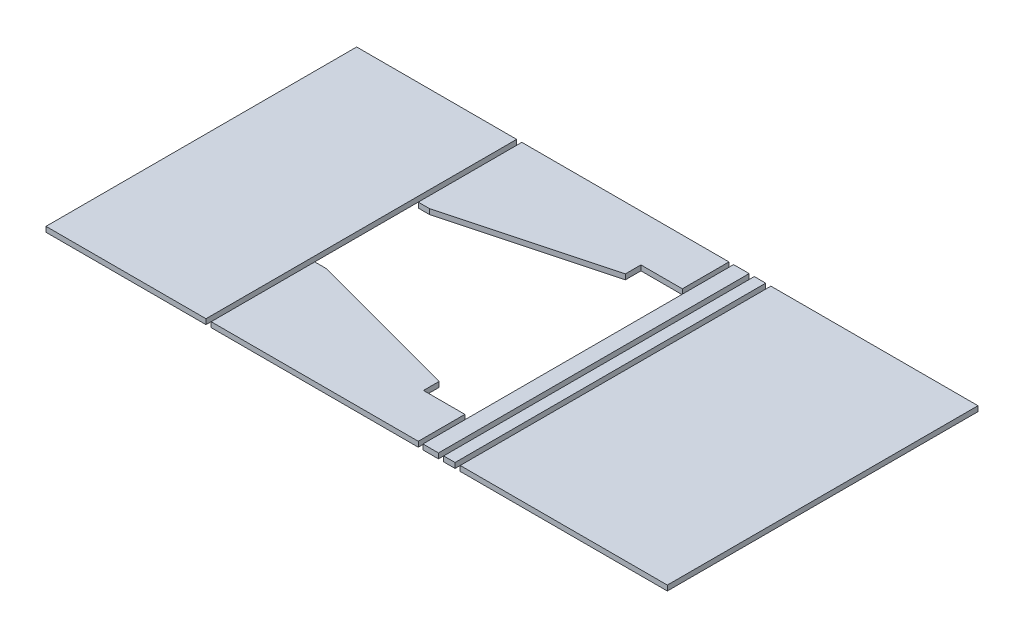
ISO-10303-21;
HEADER;
FILE_DESCRIPTION(('STEP AP214'),'2;1');
FILE_NAME('part.step','',(''),(''),'','','');
FILE_SCHEMA(('AUTOMOTIVE_DESIGN { 1 0 10303 214 1 1 1 1 }'));
ENDSEC;
DATA;
#1=APPLICATION_CONTEXT('core data for automotive mechanical design processes');
#2=APPLICATION_PROTOCOL_DEFINITION('international standard','automotive_design',2000,#1);
#3=PRODUCT_CONTEXT('',#1,'mechanical');
#4=PRODUCT('Part','Part','',(#3));
#5=PRODUCT_RELATED_PRODUCT_CATEGORY('part','',(#4));
#6=PRODUCT_DEFINITION_FORMATION('','',#4);
#7=PRODUCT_DEFINITION_CONTEXT('part definition',#1,'design');
#8=PRODUCT_DEFINITION('design','',#6,#7);
#9=PRODUCT_DEFINITION_SHAPE('','',#8);
#10=(LENGTH_UNIT() NAMED_UNIT(*) SI_UNIT(.MILLI.,.METRE.));
#11=(NAMED_UNIT(*) PLANE_ANGLE_UNIT() SI_UNIT($,.RADIAN.));
#12=(NAMED_UNIT(*) SI_UNIT($,.STERADIAN.) SOLID_ANGLE_UNIT());
#13=UNCERTAINTY_MEASURE_WITH_UNIT(LENGTH_MEASURE(1.E-05),#10,'distance_accuracy_value','');
#14=(GEOMETRIC_REPRESENTATION_CONTEXT(3) GLOBAL_UNCERTAINTY_ASSIGNED_CONTEXT((#13)) GLOBAL_UNIT_ASSIGNED_CONTEXT((#10,
#11,#12)) REPRESENTATION_CONTEXT('',''));
#15=CARTESIAN_POINT('',(0.,0.,0.));
#16=DIRECTION('',(0.,0.,1.));
#17=DIRECTION('',(1.,0.,0.));
#18=AXIS2_PLACEMENT_3D('',#15,#16,#17);
#19=CARTESIAN_POINT('',(758.,10.,-600.));
#20=DIRECTION('',(0.,0.,1.));
#21=DIRECTION('',(1.,0.,0.));
#22=AXIS2_PLACEMENT_3D('',#19,#20,#21);
#23=PLANE('',#22);
#24=DIRECTION('',(-1.,0.,0.));
#25=VECTOR('',#24,1.);
#26=CARTESIAN_POINT('',(758.,0.,-600.));
#27=LINE('',#26,#25);
#28=CARTESIAN_POINT('',(758.,0.,-600.));
#29=VERTEX_POINT('',#28);
#30=CARTESIAN_POINT('',(728.,0.,-600.));
#31=VERTEX_POINT('',#30);
#32=EDGE_CURVE('E12',#29,#31,#27,.T.);
#33=ORIENTED_EDGE('',*,*,#32,.T.);
#34=DIRECTION('',(0.,-1.,0.));
#35=VECTOR('',#34,1.);
#36=CARTESIAN_POINT('',(728.,10.,-600.));
#37=LINE('',#36,#35);
#38=CARTESIAN_POINT('',(728.,10.,-600.));
#39=VERTEX_POINT('',#38);
#40=EDGE_CURVE('E121',#39,#31,#37,.T.);
#41=ORIENTED_EDGE('',*,*,#40,.F.);
#42=DIRECTION('',(-1.,0.,0.));
#43=VECTOR('',#42,1.);
#44=CARTESIAN_POINT('',(758.,10.,-600.));
#45=LINE('',#44,#43);
#46=CARTESIAN_POINT('',(758.,10.,-600.));
#47=VERTEX_POINT('',#46);
#48=EDGE_CURVE('E54',#47,#39,#45,.T.);
#49=ORIENTED_EDGE('',*,*,#48,.F.);
#50=DIRECTION('',(0.,-1.,0.));
#51=VECTOR('',#50,1.);
#52=CARTESIAN_POINT('',(758.,10.,-600.));
#53=LINE('',#52,#51);
#54=EDGE_CURVE('E94',#47,#29,#53,.T.);
#55=ORIENTED_EDGE('',*,*,#54,.T.);
#56=EDGE_LOOP('',(#33,#41,#49,#55));
#57=FACE_BOUND('',#56,.T.);
#58=ADVANCED_FACE('F50',(#57),#23,.F.);
#59=CARTESIAN_POINT('',(728.,10.,-600.));
#60=DIRECTION('',(1.,0.,0.));
#61=DIRECTION('',(0.,0.,-1.));
#62=AXIS2_PLACEMENT_3D('',#59,#60,#61);
#63=PLANE('',#62);
#64=DIRECTION('',(0.,0.,1.));
#65=VECTOR('',#64,1.);
#66=CARTESIAN_POINT('',(728.,0.,-600.));
#67=LINE('',#66,#65);
#68=CARTESIAN_POINT('',(728.,0.,0.));
#69=VERTEX_POINT('',#68);
#70=EDGE_CURVE('E60',#31,#69,#67,.T.);
#71=ORIENTED_EDGE('',*,*,#70,.T.);
#72=DIRECTION('',(0.,-1.,0.));
#73=VECTOR('',#72,1.);
#74=CARTESIAN_POINT('',(728.,10.,0.));
#75=LINE('',#74,#73);
#76=CARTESIAN_POINT('',(728.,10.,0.));
#77=VERTEX_POINT('',#76);
#78=EDGE_CURVE('E108',#77,#69,#75,.T.);
#79=ORIENTED_EDGE('',*,*,#78,.F.);
#80=DIRECTION('',(0.,0.,1.));
#81=VECTOR('',#80,1.);
#82=CARTESIAN_POINT('',(728.,10.,-600.));
#83=LINE('',#82,#81);
#84=EDGE_CURVE('E86',#39,#77,#83,.T.);
#85=ORIENTED_EDGE('',*,*,#84,.F.);
#86=ORIENTED_EDGE('',*,*,#40,.T.);
#87=EDGE_LOOP('',(#71,#79,#85,#86));
#88=FACE_BOUND('',#87,.T.);
#89=ADVANCED_FACE('F124',(#88),#63,.F.);
#90=CARTESIAN_POINT('',(758.,10.,0.));
#91=DIRECTION('',(0.,0.,1.));
#92=DIRECTION('',(1.,0.,0.));
#93=AXIS2_PLACEMENT_3D('',#90,#91,#92);
#94=PLANE('',#93);
#95=DIRECTION('',(-1.,0.,0.));
#96=VECTOR('',#95,1.);
#97=CARTESIAN_POINT('',(758.,0.,0.));
#98=LINE('',#97,#96);
#99=CARTESIAN_POINT('',(758.,0.,0.));
#100=VERTEX_POINT('',#99);
#101=EDGE_CURVE('E110',#100,#69,#98,.T.);
#102=ORIENTED_EDGE('',*,*,#101,.F.);
#103=DIRECTION('',(0.,-1.,0.));
#104=VECTOR('',#103,1.);
#105=CARTESIAN_POINT('',(758.,10.,0.));
#106=LINE('',#105,#104);
#107=CARTESIAN_POINT('',(758.,10.,0.));
#108=VERTEX_POINT('',#107);
#109=EDGE_CURVE('E99',#108,#100,#106,.T.);
#110=ORIENTED_EDGE('',*,*,#109,.F.);
#111=DIRECTION('',(-1.,0.,0.));
#112=VECTOR('',#111,1.);
#113=CARTESIAN_POINT('',(758.,10.,0.));
#114=LINE('',#113,#112);
#115=EDGE_CURVE('E119',#108,#77,#114,.T.);
#116=ORIENTED_EDGE('',*,*,#115,.T.);
#117=ORIENTED_EDGE('',*,*,#78,.T.);
#118=EDGE_LOOP('',(#102,#110,#116,#117));
#119=FACE_BOUND('',#118,.T.);
#120=ADVANCED_FACE('F111',(#119),#94,.T.);
#121=CARTESIAN_POINT('',(758.,10.,-600.));
#122=DIRECTION('',(1.,0.,0.));
#123=DIRECTION('',(0.,0.,-1.));
#124=AXIS2_PLACEMENT_3D('',#121,#122,#123);
#125=PLANE('',#124);
#126=DIRECTION('',(0.,0.,1.));
#127=VECTOR('',#126,1.);
#128=CARTESIAN_POINT('',(758.,0.,-600.));
#129=LINE('',#128,#127);
#130=EDGE_CURVE('E103',#29,#100,#129,.T.);
#131=ORIENTED_EDGE('',*,*,#130,.F.);
#132=ORIENTED_EDGE('',*,*,#54,.F.);
#133=DIRECTION('',(0.,0.,1.));
#134=VECTOR('',#133,1.);
#135=CARTESIAN_POINT('',(758.,10.,-600.));
#136=LINE('',#135,#134);
#137=EDGE_CURVE('E105',#47,#108,#136,.T.);
#138=ORIENTED_EDGE('',*,*,#137,.T.);
#139=ORIENTED_EDGE('',*,*,#109,.T.);
#140=EDGE_LOOP('',(#131,#132,#138,#139));
#141=FACE_BOUND('',#140,.T.);
#142=ADVANCED_FACE('F101',(#141),#125,.T.);
#143=CARTESIAN_POINT('',(0.,10.,0.));
#144=DIRECTION('',(0.,1.,0.));
#145=DIRECTION('',(0.,0.,1.));
#146=AXIS2_PLACEMENT_3D('',#143,#144,#145);
#147=PLANE('',#146);
#148=ORIENTED_EDGE('',*,*,#48,.T.);
#149=ORIENTED_EDGE('',*,*,#84,.T.);
#150=ORIENTED_EDGE('',*,*,#115,.F.);
#151=ORIENTED_EDGE('',*,*,#137,.F.);
#152=EDGE_LOOP('',(#148,#149,#150,#151));
#153=FACE_BOUND('',#152,.T.);
#154=ADVANCED_FACE('F52',(#153),#147,.T.);
#155=CARTESIAN_POINT('',(0.,0.,0.));
#156=DIRECTION('',(0.,1.,0.));
#157=DIRECTION('',(0.,0.,1.));
#158=AXIS2_PLACEMENT_3D('',#155,#156,#157);
#159=PLANE('',#158);
#160=ORIENTED_EDGE('',*,*,#32,.F.);
#161=ORIENTED_EDGE('',*,*,#130,.T.);
#162=ORIENTED_EDGE('',*,*,#101,.T.);
#163=ORIENTED_EDGE('',*,*,#70,.F.);
#164=EDGE_LOOP('',(#160,#161,#162,#163));
#165=FACE_BOUND('',#164,.T.);
#166=ADVANCED_FACE('F113',(#165),#159,.F.);
#167=CLOSED_SHELL('',(#58,#89,#120,#142,#154,#166));
#168=MANIFOLD_SOLID_BREP('B2',#167);
#169=CARTESIAN_POINT('',(790.,10.,0.));
#170=DIRECTION('',(0.,0.,1.));
#171=DIRECTION('',(1.,0.,0.));
#172=AXIS2_PLACEMENT_3D('',#169,#170,#171);
#173=PLANE('',#172);
#174=DIRECTION('',(-1.,0.,0.));
#175=VECTOR('',#174,1.);
#176=CARTESIAN_POINT('',(790.,0.,0.));
#177=LINE('',#176,#175);
#178=CARTESIAN_POINT('',(790.,0.,0.));
#179=VERTEX_POINT('',#178);
#180=CARTESIAN_POINT('',(768.,0.,0.));
#181=VERTEX_POINT('',#180);
#182=EDGE_CURVE('E48',#179,#181,#177,.T.);
#183=ORIENTED_EDGE('',*,*,#182,.F.);
#184=DIRECTION('',(0.,-1.,0.));
#185=VECTOR('',#184,1.);
#186=CARTESIAN_POINT('',(790.,10.,0.));
#187=LINE('',#186,#185);
#188=CARTESIAN_POINT('',(790.,10.,0.));
#189=VERTEX_POINT('',#188);
#190=EDGE_CURVE('E230',#189,#179,#187,.T.);
#191=ORIENTED_EDGE('',*,*,#190,.F.);
#192=DIRECTION('',(-1.,0.,0.));
#193=VECTOR('',#192,1.);
#194=CARTESIAN_POINT('',(790.,10.,0.));
#195=LINE('',#194,#193);
#196=CARTESIAN_POINT('',(768.,10.,0.));
#197=VERTEX_POINT('',#196);
#198=EDGE_CURVE('E188',#189,#197,#195,.T.);
#199=ORIENTED_EDGE('',*,*,#198,.T.);
#200=DIRECTION('',(0.,-1.,0.));
#201=VECTOR('',#200,1.);
#202=CARTESIAN_POINT('',(768.,10.,0.));
#203=LINE('',#202,#201);
#204=EDGE_CURVE('E203',#197,#181,#203,.T.);
#205=ORIENTED_EDGE('',*,*,#204,.T.);
#206=EDGE_LOOP('',(#183,#191,#199,#205));
#207=FACE_BOUND('',#206,.T.);
#208=ADVANCED_FACE('F184',(#207),#173,.T.);
#209=CARTESIAN_POINT('',(790.,10.,0.));
#210=DIRECTION('',(-1.,0.,0.));
#211=DIRECTION('',(0.,0.,1.));
#212=AXIS2_PLACEMENT_3D('',#209,#210,#211);
#213=PLANE('',#212);
#214=DIRECTION('',(0.,0.,-1.));
#215=VECTOR('',#214,1.);
#216=CARTESIAN_POINT('',(790.,0.,0.));
#217=LINE('',#216,#215);
#218=CARTESIAN_POINT('',(790.,0.,-600.));
#219=VERTEX_POINT('',#218);
#220=EDGE_CURVE('E233',#179,#219,#217,.T.);
#221=ORIENTED_EDGE('',*,*,#220,.T.);
#222=DIRECTION('',(0.,-1.,0.));
#223=VECTOR('',#222,1.);
#224=CARTESIAN_POINT('',(790.,10.,-600.));
#225=LINE('',#224,#223);
#226=CARTESIAN_POINT('',(790.,10.,-600.));
#227=VERTEX_POINT('',#226);
#228=EDGE_CURVE('E236',#227,#219,#225,.T.);
#229=ORIENTED_EDGE('',*,*,#228,.F.);
#230=DIRECTION('',(0.,0.,-1.));
#231=VECTOR('',#230,1.);
#232=CARTESIAN_POINT('',(790.,10.,0.));
#233=LINE('',#232,#231);
#234=EDGE_CURVE('E252',#189,#227,#233,.T.);
#235=ORIENTED_EDGE('',*,*,#234,.F.);
#236=ORIENTED_EDGE('',*,*,#190,.T.);
#237=EDGE_LOOP('',(#221,#229,#235,#236));
#238=FACE_BOUND('',#237,.T.);
#239=ADVANCED_FACE('F235',(#238),#213,.F.);
#240=CARTESIAN_POINT('',(790.,10.,-600.));
#241=DIRECTION('',(0.,0.,1.));
#242=DIRECTION('',(1.,0.,0.));
#243=AXIS2_PLACEMENT_3D('',#240,#241,#242);
#244=PLANE('',#243);
#245=DIRECTION('',(-1.,0.,0.));
#246=VECTOR('',#245,1.);
#247=CARTESIAN_POINT('',(790.,0.,-600.));
#248=LINE('',#247,#246);
#249=CARTESIAN_POINT('',(768.,0.,-600.));
#250=VERTEX_POINT('',#249);
#251=EDGE_CURVE('E239',#219,#250,#248,.T.);
#252=ORIENTED_EDGE('',*,*,#251,.T.);
#253=DIRECTION('',(0.,-1.,0.));
#254=VECTOR('',#253,1.);
#255=CARTESIAN_POINT('',(768.,10.,-600.));
#256=LINE('',#255,#254);
#257=CARTESIAN_POINT('',(768.,10.,-600.));
#258=VERTEX_POINT('',#257);
#259=EDGE_CURVE('E245',#258,#250,#256,.T.);
#260=ORIENTED_EDGE('',*,*,#259,.F.);
#261=DIRECTION('',(-1.,0.,0.));
#262=VECTOR('',#261,1.);
#263=CARTESIAN_POINT('',(790.,10.,-600.));
#264=LINE('',#263,#262);
#265=EDGE_CURVE('E220',#227,#258,#264,.T.);
#266=ORIENTED_EDGE('',*,*,#265,.F.);
#267=ORIENTED_EDGE('',*,*,#228,.T.);
#268=EDGE_LOOP('',(#252,#260,#266,#267));
#269=FACE_BOUND('',#268,.T.);
#270=ADVANCED_FACE('F243',(#269),#244,.F.);
#271=CARTESIAN_POINT('',(768.,10.,0.));
#272=DIRECTION('',(-1.,0.,0.));
#273=DIRECTION('',(0.,0.,1.));
#274=AXIS2_PLACEMENT_3D('',#271,#272,#273);
#275=PLANE('',#274);
#276=DIRECTION('',(0.,0.,-1.));
#277=VECTOR('',#276,1.);
#278=CARTESIAN_POINT('',(768.,0.,0.));
#279=LINE('',#278,#277);
#280=EDGE_CURVE('E194',#181,#250,#279,.T.);
#281=ORIENTED_EDGE('',*,*,#280,.F.);
#282=ORIENTED_EDGE('',*,*,#204,.F.);
#283=DIRECTION('',(0.,0.,-1.));
#284=VECTOR('',#283,1.);
#285=CARTESIAN_POINT('',(768.,10.,0.));
#286=LINE('',#285,#284);
#287=EDGE_CURVE('E254',#197,#258,#286,.T.);
#288=ORIENTED_EDGE('',*,*,#287,.T.);
#289=ORIENTED_EDGE('',*,*,#259,.T.);
#290=EDGE_LOOP('',(#281,#282,#288,#289));
#291=FACE_BOUND('',#290,.T.);
#292=ADVANCED_FACE('F257',(#291),#275,.T.);
#293=CARTESIAN_POINT('',(0.,10.,0.));
#294=DIRECTION('',(0.,-1.,0.));
#295=DIRECTION('',(0.,0.,-1.));
#296=AXIS2_PLACEMENT_3D('',#293,#294,#295);
#297=PLANE('',#296);
#298=ORIENTED_EDGE('',*,*,#198,.F.);
#299=ORIENTED_EDGE('',*,*,#234,.T.);
#300=ORIENTED_EDGE('',*,*,#265,.T.);
#301=ORIENTED_EDGE('',*,*,#287,.F.);
#302=EDGE_LOOP('',(#298,#299,#300,#301));
#303=FACE_BOUND('',#302,.T.);
#304=ADVANCED_FACE('F186',(#303),#297,.F.);
#305=CARTESIAN_POINT('',(0.,0.,0.));
#306=DIRECTION('',(0.,-1.,0.));
#307=DIRECTION('',(0.,0.,-1.));
#308=AXIS2_PLACEMENT_3D('',#305,#306,#307);
#309=PLANE('',#308);
#310=ORIENTED_EDGE('',*,*,#182,.T.);
#311=ORIENTED_EDGE('',*,*,#280,.T.);
#312=ORIENTED_EDGE('',*,*,#251,.F.);
#313=ORIENTED_EDGE('',*,*,#220,.F.);
#314=EDGE_LOOP('',(#310,#311,#312,#313));
#315=FACE_BOUND('',#314,.T.);
#316=ADVANCED_FACE('F247',(#315),#309,.T.);
#317=CLOSED_SHELL('',(#208,#239,#270,#292,#304,#316));
#318=MANIFOLD_SOLID_BREP('B6',#317);
#319=CARTESIAN_POINT('',(639.,10.,0.));
#320=DIRECTION('',(-1.,0.,0.));
#321=DIRECTION('',(0.,0.,1.));
#322=AXIS2_PLACEMENT_3D('',#319,#320,#321);
#323=PLANE('',#322);
#324=DIRECTION('',(0.,0.,-1.));
#325=VECTOR('',#324,1.);
#326=CARTESIAN_POINT('',(639.,0.,0.));
#327=LINE('',#326,#325);
#328=CARTESIAN_POINT('',(639.,0.,-90.));
#329=VERTEX_POINT('',#328);
#330=CARTESIAN_POINT('',(639.,0.,-120.));
#331=VERTEX_POINT('',#330);
#332=EDGE_CURVE('E182',#329,#331,#327,.T.);
#333=ORIENTED_EDGE('',*,*,#332,.T.);
#334=DIRECTION('',(0.,-1.,0.));
#335=VECTOR('',#334,1.);
#336=CARTESIAN_POINT('',(639.,10.,-120.));
#337=LINE('',#336,#335);
#338=CARTESIAN_POINT('',(639.,10.,-120.));
#339=VERTEX_POINT('',#338);
#340=EDGE_CURVE('E434',#339,#331,#337,.T.);
#341=ORIENTED_EDGE('',*,*,#340,.F.);
#342=DIRECTION('',(0.,0.,-1.));
#343=VECTOR('',#342,1.);
#344=CARTESIAN_POINT('',(639.,10.,0.));
#345=LINE('',#344,#343);
#346=CARTESIAN_POINT('',(639.,10.,-90.));
#347=VERTEX_POINT('',#346);
#348=EDGE_CURVE('E322',#347,#339,#345,.T.);
#349=ORIENTED_EDGE('',*,*,#348,.F.);
#350=DIRECTION('',(0.,-1.,0.));
#351=VECTOR('',#350,1.);
#352=CARTESIAN_POINT('',(639.,10.,-90.));
#353=LINE('',#352,#351);
#354=EDGE_CURVE('E416',#347,#329,#353,.T.);
#355=ORIENTED_EDGE('',*,*,#354,.T.);
#356=EDGE_LOOP('',(#333,#341,#349,#355));
#357=FACE_BOUND('',#356,.T.);
#358=ADVANCED_FACE('F318',(#357),#323,.F.);
#359=CARTESIAN_POINT('',(72.804883490869,10.,-271.711524227063));
#360=DIRECTION('',(-0.258819045102514,0.,0.96592582628907));
#361=DIRECTION('',(0.96592582628907,0.,0.258819045102514));
#362=AXIS2_PLACEMENT_3D('',#359,#360,#361);
#363=PLANE('',#362);
#364=DIRECTION('',(-0.96592582628907,0.,-0.258819045102514));
#365=VECTOR('',#364,1.);
#366=CARTESIAN_POINT('',(72.804883490869,0.,-271.711524227063));
#367=LINE('',#366,#365);
#368=CARTESIAN_POINT('',(340.435935394482,0.,-200.));
#369=VERTEX_POINT('',#368);
#370=EDGE_CURVE('E328',#331,#369,#367,.T.);
#371=ORIENTED_EDGE('',*,*,#370,.T.);
#372=DIRECTION('',(0.,-1.,0.));
#373=VECTOR('',#372,1.);
#374=CARTESIAN_POINT('',(340.435935394482,10.,-200.));
#375=LINE('',#374,#373);
#376=CARTESIAN_POINT('',(340.435935394482,10.,-200.));
#377=VERTEX_POINT('',#376);
#378=EDGE_CURVE('E398',#377,#369,#375,.T.);
#379=ORIENTED_EDGE('',*,*,#378,.F.);
#380=DIRECTION('',(-0.96592582628907,0.,-0.258819045102514));
#381=VECTOR('',#380,1.);
#382=CARTESIAN_POINT('',(72.804883490869,10.,-271.711524227063));
#383=LINE('',#382,#381);
#384=EDGE_CURVE('E363',#339,#377,#383,.T.);
#385=ORIENTED_EDGE('',*,*,#384,.F.);
#386=ORIENTED_EDGE('',*,*,#340,.T.);
#387=EDGE_LOOP('',(#371,#379,#385,#386));
#388=FACE_BOUND('',#387,.T.);
#389=ADVANCED_FACE('F435',(#388),#363,.F.);
#390=CARTESIAN_POINT('',(0.,10.,-200.));
#391=DIRECTION('',(0.,0.,-1.));
#392=DIRECTION('',(-1.,0.,0.));
#393=AXIS2_PLACEMENT_3D('',#390,#391,#392);
#394=PLANE('',#393);
#395=DIRECTION('',(1.,0.,0.));
#396=VECTOR('',#395,1.);
#397=CARTESIAN_POINT('',(0.,0.,-200.));
#398=LINE('',#397,#396);
#399=CARTESIAN_POINT('',(319.,0.,-200.));
#400=VERTEX_POINT('',#399);
#401=EDGE_CURVE('E400',#400,#369,#398,.T.);
#402=ORIENTED_EDGE('',*,*,#401,.F.);
#403=DIRECTION('',(0.,-1.,0.));
#404=VECTOR('',#403,1.);
#405=CARTESIAN_POINT('',(319.,10.,-200.));
#406=LINE('',#405,#404);
#407=CARTESIAN_POINT('',(319.,10.,-200.));
#408=VERTEX_POINT('',#407);
#409=EDGE_CURVE('E388',#408,#400,#406,.T.);
#410=ORIENTED_EDGE('',*,*,#409,.F.);
#411=DIRECTION('',(1.,0.,0.));
#412=VECTOR('',#411,1.);
#413=CARTESIAN_POINT('',(0.,10.,-200.));
#414=LINE('',#413,#412);
#415=EDGE_CURVE('E421',#408,#377,#414,.T.);
#416=ORIENTED_EDGE('',*,*,#415,.T.);
#417=ORIENTED_EDGE('',*,*,#378,.T.);
#418=EDGE_LOOP('',(#402,#410,#416,#417));
#419=FACE_BOUND('',#418,.T.);
#420=ADVANCED_FACE('F401',(#419),#394,.T.);
#421=CARTESIAN_POINT('',(319.,10.,0.));
#422=DIRECTION('',(-1.,0.,0.));
#423=DIRECTION('',(0.,0.,1.));
#424=AXIS2_PLACEMENT_3D('',#421,#422,#423);
#425=PLANE('',#424);
#426=DIRECTION('',(0.,0.,-1.));
#427=VECTOR('',#426,1.);
#428=CARTESIAN_POINT('',(319.,0.,0.));
#429=LINE('',#428,#427);
#430=CARTESIAN_POINT('',(319.,0.,0.));
#431=VERTEX_POINT('',#430);
#432=EDGE_CURVE('E392',#431,#400,#429,.T.);
#433=ORIENTED_EDGE('',*,*,#432,.F.);
#434=DIRECTION('',(0.,-1.,0.));
#435=VECTOR('',#434,1.);
#436=CARTESIAN_POINT('',(319.,10.,0.));
#437=LINE('',#436,#435);
#438=CARTESIAN_POINT('',(319.,10.,0.));
#439=VERTEX_POINT('',#438);
#440=EDGE_CURVE('E397',#439,#431,#437,.T.);
#441=ORIENTED_EDGE('',*,*,#440,.F.);
#442=DIRECTION('',(0.,0.,-1.));
#443=VECTOR('',#442,1.);
#444=CARTESIAN_POINT('',(319.,10.,0.));
#445=LINE('',#444,#443);
#446=EDGE_CURVE('E394',#439,#408,#445,.T.);
#447=ORIENTED_EDGE('',*,*,#446,.T.);
#448=ORIENTED_EDGE('',*,*,#409,.T.);
#449=EDGE_LOOP('',(#433,#441,#447,#448));
#450=FACE_BOUND('',#449,.T.);
#451=ADVANCED_FACE('F390',(#450),#425,.T.);
#452=CARTESIAN_POINT('',(0.,10.,0.));
#453=DIRECTION('',(0.,0.,-1.));
#454=DIRECTION('',(-1.,0.,0.));
#455=AXIS2_PLACEMENT_3D('',#452,#453,#454);
#456=PLANE('',#455);
#457=DIRECTION('',(1.,0.,0.));
#458=VECTOR('',#457,1.);
#459=CARTESIAN_POINT('',(0.,0.,0.));
#460=LINE('',#459,#458);
#461=CARTESIAN_POINT('',(719.,0.,0.));
#462=VERTEX_POINT('',#461);
#463=EDGE_CURVE('E406',#431,#462,#460,.T.);
#464=ORIENTED_EDGE('',*,*,#463,.T.);
#465=DIRECTION('',(0.,-1.,0.));
#466=VECTOR('',#465,1.);
#467=CARTESIAN_POINT('',(719.,10.,0.));
#468=LINE('',#467,#466);
#469=CARTESIAN_POINT('',(719.,10.,0.));
#470=VERTEX_POINT('',#469);
#471=EDGE_CURVE('E429',#470,#462,#468,.T.);
#472=ORIENTED_EDGE('',*,*,#471,.F.);
#473=DIRECTION('',(1.,0.,0.));
#474=VECTOR('',#473,1.);
#475=CARTESIAN_POINT('',(0.,10.,0.));
#476=LINE('',#475,#474);
#477=EDGE_CURVE('E418',#439,#470,#476,.T.);
#478=ORIENTED_EDGE('',*,*,#477,.F.);
#479=ORIENTED_EDGE('',*,*,#440,.T.);
#480=EDGE_LOOP('',(#464,#472,#478,#479));
#481=FACE_BOUND('',#480,.T.);
#482=ADVANCED_FACE('F446',(#481),#456,.F.);
#483=CARTESIAN_POINT('',(719.,10.,0.));
#484=DIRECTION('',(-1.,0.,0.));
#485=DIRECTION('',(0.,0.,1.));
#486=AXIS2_PLACEMENT_3D('',#483,#484,#485);
#487=PLANE('',#486);
#488=DIRECTION('',(0.,0.,-1.));
#489=VECTOR('',#488,1.);
#490=CARTESIAN_POINT('',(719.,0.,0.));
#491=LINE('',#490,#489);
#492=CARTESIAN_POINT('',(719.,0.,-90.));
#493=VERTEX_POINT('',#492);
#494=EDGE_CURVE('E408',#462,#493,#491,.T.);
#495=ORIENTED_EDGE('',*,*,#494,.T.);
#496=DIRECTION('',(0.,-1.,0.));
#497=VECTOR('',#496,1.);
#498=CARTESIAN_POINT('',(719.,10.,-90.));
#499=LINE('',#498,#497);
#500=CARTESIAN_POINT('',(719.,10.,-90.));
#501=VERTEX_POINT('',#500);
#502=EDGE_CURVE('E427',#501,#493,#499,.T.);
#503=ORIENTED_EDGE('',*,*,#502,.F.);
#504=DIRECTION('',(0.,0.,-1.));
#505=VECTOR('',#504,1.);
#506=CARTESIAN_POINT('',(719.,10.,0.));
#507=LINE('',#506,#505);
#508=EDGE_CURVE('E415',#470,#501,#507,.T.);
#509=ORIENTED_EDGE('',*,*,#508,.F.);
#510=ORIENTED_EDGE('',*,*,#471,.T.);
#511=EDGE_LOOP('',(#495,#503,#509,#510));
#512=FACE_BOUND('',#511,.T.);
#513=ADVANCED_FACE('F439',(#512),#487,.F.);
#514=CARTESIAN_POINT('',(0.,10.,-89.9999999999999));
#515=DIRECTION('',(0.,0.,1.));
#516=DIRECTION('',(1.,0.,0.));
#517=AXIS2_PLACEMENT_3D('',#514,#515,#516);
#518=PLANE('',#517);
#519=DIRECTION('',(-1.,0.,0.));
#520=VECTOR('',#519,1.);
#521=CARTESIAN_POINT('',(0.,0.,-89.9999999999999));
#522=LINE('',#521,#520);
#523=EDGE_CURVE('E374',#493,#329,#522,.T.);
#524=ORIENTED_EDGE('',*,*,#523,.T.);
#525=ORIENTED_EDGE('',*,*,#354,.F.);
#526=DIRECTION('',(-1.,0.,0.));
#527=VECTOR('',#526,1.);
#528=CARTESIAN_POINT('',(0.,10.,-89.9999999999999));
#529=LINE('',#528,#527);
#530=EDGE_CURVE('E413',#501,#347,#529,.T.);
#531=ORIENTED_EDGE('',*,*,#530,.F.);
#532=ORIENTED_EDGE('',*,*,#502,.T.);
#533=EDGE_LOOP('',(#524,#525,#531,#532));
#534=FACE_BOUND('',#533,.T.);
#535=ADVANCED_FACE('F443',(#534),#518,.F.);
#536=CARTESIAN_POINT('',(0.,10.,0.));
#537=DIRECTION('',(0.,1.,0.));
#538=DIRECTION('',(0.,0.,1.));
#539=AXIS2_PLACEMENT_3D('',#536,#537,#538);
#540=PLANE('',#539);
#541=ORIENTED_EDGE('',*,*,#348,.T.);
#542=ORIENTED_EDGE('',*,*,#384,.T.);
#543=ORIENTED_EDGE('',*,*,#415,.F.);
#544=ORIENTED_EDGE('',*,*,#446,.F.);
#545=ORIENTED_EDGE('',*,*,#477,.T.);
#546=ORIENTED_EDGE('',*,*,#508,.T.);
#547=ORIENTED_EDGE('',*,*,#530,.T.);
#548=EDGE_LOOP('',(#541,#542,#543,#544,#545,#546,#547));
#549=FACE_BOUND('',#548,.T.);
#550=ADVANCED_FACE('F320',(#549),#540,.T.);
#551=CARTESIAN_POINT('',(0.,0.,0.));
#552=DIRECTION('',(0.,1.,0.));
#553=DIRECTION('',(0.,0.,1.));
#554=AXIS2_PLACEMENT_3D('',#551,#552,#553);
#555=PLANE('',#554);
#556=ORIENTED_EDGE('',*,*,#332,.F.);
#557=ORIENTED_EDGE('',*,*,#523,.F.);
#558=ORIENTED_EDGE('',*,*,#494,.F.);
#559=ORIENTED_EDGE('',*,*,#463,.F.);
#560=ORIENTED_EDGE('',*,*,#432,.T.);
#561=ORIENTED_EDGE('',*,*,#401,.T.);
#562=ORIENTED_EDGE('',*,*,#370,.F.);
#563=EDGE_LOOP('',(#556,#557,#558,#559,#560,#561,#562));
#564=FACE_BOUND('',#563,.T.);
#565=ADVANCED_FACE('F404',(#564),#555,.F.);
#566=CLOSED_SHELL('',(#358,#389,#420,#451,#482,#513,#535,#550,#565));
#567=MANIFOLD_SOLID_BREP('B42',#566);
#568=CARTESIAN_POINT('',(0.,10.,-600.));
#569=DIRECTION('',(0.,0.,-1.));
#570=DIRECTION('',(-1.,0.,0.));
#571=AXIS2_PLACEMENT_3D('',#568,#569,#570);
#572=PLANE('',#571);
#573=DIRECTION('',(1.,0.,0.));
#574=VECTOR('',#573,1.);
#575=CARTESIAN_POINT('',(0.,0.,-600.));
#576=LINE('',#575,#574);
#577=CARTESIAN_POINT('',(800.,0.,-600.));
#578=VERTEX_POINT('',#577);
#579=CARTESIAN_POINT('',(1200.,0.,-600.));
#580=VERTEX_POINT('',#579);
#581=EDGE_CURVE('E316',#578,#580,#576,.T.);
#582=ORIENTED_EDGE('',*,*,#581,.F.);
#583=DIRECTION('',(0.,-1.,0.));
#584=VECTOR('',#583,1.);
#585=CARTESIAN_POINT('',(800.,10.,-600.));
#586=LINE('',#585,#584);
#587=CARTESIAN_POINT('',(800.,10.,-600.));
#588=VERTEX_POINT('',#587);
#589=EDGE_CURVE('E553',#588,#578,#586,.T.);
#590=ORIENTED_EDGE('',*,*,#589,.F.);
#591=DIRECTION('',(1.,0.,0.));
#592=VECTOR('',#591,1.);
#593=CARTESIAN_POINT('',(0.,10.,-600.));
#594=LINE('',#593,#592);
#595=CARTESIAN_POINT('',(1200.,10.,-600.));
#596=VERTEX_POINT('',#595);
#597=EDGE_CURVE('E537',#588,#596,#594,.T.);
#598=ORIENTED_EDGE('',*,*,#597,.T.);
#599=DIRECTION('',(0.,-1.,0.));
#600=VECTOR('',#599,1.);
#601=CARTESIAN_POINT('',(1200.,10.,-600.));
#602=LINE('',#601,#600);
#603=EDGE_CURVE('E577',#596,#580,#602,.T.);
#604=ORIENTED_EDGE('',*,*,#603,.T.);
#605=EDGE_LOOP('',(#582,#590,#598,#604));
#606=FACE_BOUND('',#605,.T.);
#607=ADVANCED_FACE('F533',(#606),#572,.T.);
#608=CARTESIAN_POINT('',(800.,10.,-1.48029736616688E-13));
#609=DIRECTION('',(1.,0.,0.));
#610=DIRECTION('',(0.,0.,-1.));
#611=AXIS2_PLACEMENT_3D('',#608,#609,#610);
#612=PLANE('',#611);
#613=DIRECTION('',(0.,0.,1.));
#614=VECTOR('',#613,1.);
#615=CARTESIAN_POINT('',(800.,0.,-1.48029736616688E-13));
#616=LINE('',#615,#614);
#617=CARTESIAN_POINT('',(800.,0.,0.));
#618=VERTEX_POINT('',#617);
#619=EDGE_CURVE('E544',#578,#618,#616,.T.);
#620=ORIENTED_EDGE('',*,*,#619,.T.);
#621=DIRECTION('',(0.,-1.,0.));
#622=VECTOR('',#621,1.);
#623=CARTESIAN_POINT('',(800.,10.,0.));
#624=LINE('',#623,#622);
#625=CARTESIAN_POINT('',(800.,10.,0.));
#626=VERTEX_POINT('',#625);
#627=EDGE_CURVE('E590',#626,#618,#624,.T.);
#628=ORIENTED_EDGE('',*,*,#627,.F.);
#629=DIRECTION('',(0.,0.,1.));
#630=VECTOR('',#629,1.);
#631=CARTESIAN_POINT('',(800.,10.,-1.48029736616688E-13));
#632=LINE('',#631,#630);
#633=EDGE_CURVE('E568',#588,#626,#632,.T.);
#634=ORIENTED_EDGE('',*,*,#633,.F.);
#635=ORIENTED_EDGE('',*,*,#589,.T.);
#636=EDGE_LOOP('',(#620,#628,#634,#635));
#637=FACE_BOUND('',#636,.T.);
#638=ADVANCED_FACE('F620',(#637),#612,.F.);
#639=CARTESIAN_POINT('',(0.,10.,0.));
#640=DIRECTION('',(0.,0.,-1.));
#641=DIRECTION('',(-1.,0.,0.));
#642=AXIS2_PLACEMENT_3D('',#639,#640,#641);
#643=PLANE('',#642);
#644=DIRECTION('',(1.,0.,0.));
#645=VECTOR('',#644,1.);
#646=CARTESIAN_POINT('',(0.,0.,0.));
#647=LINE('',#646,#645);
#648=CARTESIAN_POINT('',(1200.,0.,0.));
#649=VERTEX_POINT('',#648);
#650=EDGE_CURVE('E584',#618,#649,#647,.T.);
#651=ORIENTED_EDGE('',*,*,#650,.T.);
#652=DIRECTION('',(0.,-1.,0.));
#653=VECTOR('',#652,1.);
#654=CARTESIAN_POINT('',(1200.,10.,0.));
#655=LINE('',#654,#653);
#656=CARTESIAN_POINT('',(1200.,10.,0.));
#657=VERTEX_POINT('',#656);
#658=EDGE_CURVE('E588',#657,#649,#655,.T.);
#659=ORIENTED_EDGE('',*,*,#658,.F.);
#660=DIRECTION('',(1.,0.,0.));
#661=VECTOR('',#660,1.);
#662=CARTESIAN_POINT('',(0.,10.,0.));
#663=LINE('',#662,#661);
#664=EDGE_CURVE('E611',#626,#657,#663,.T.);
#665=ORIENTED_EDGE('',*,*,#664,.F.);
#666=ORIENTED_EDGE('',*,*,#627,.T.);
#667=EDGE_LOOP('',(#651,#659,#665,#666));
#668=FACE_BOUND('',#667,.T.);
#669=ADVANCED_FACE('F586',(#668),#643,.F.);
#670=CARTESIAN_POINT('',(1200.,10.,0.));
#671=DIRECTION('',(-1.,0.,0.));
#672=DIRECTION('',(0.,0.,1.));
#673=AXIS2_PLACEMENT_3D('',#670,#671,#672);
#674=PLANE('',#673);
#675=DIRECTION('',(0.,0.,-1.));
#676=VECTOR('',#675,1.);
#677=CARTESIAN_POINT('',(1200.,0.,0.));
#678=LINE('',#677,#676);
#679=EDGE_CURVE('E594',#649,#580,#678,.T.);
#680=ORIENTED_EDGE('',*,*,#679,.T.);
#681=ORIENTED_EDGE('',*,*,#603,.F.);
#682=DIRECTION('',(0.,0.,-1.));
#683=VECTOR('',#682,1.);
#684=CARTESIAN_POINT('',(1200.,10.,0.));
#685=LINE('',#684,#683);
#686=EDGE_CURVE('E598',#657,#596,#685,.T.);
#687=ORIENTED_EDGE('',*,*,#686,.F.);
#688=ORIENTED_EDGE('',*,*,#658,.T.);
#689=EDGE_LOOP('',(#680,#681,#687,#688));
#690=FACE_BOUND('',#689,.T.);
#691=ADVANCED_FACE('F597',(#690),#674,.F.);
#692=CARTESIAN_POINT('',(0.,10.,0.));
#693=DIRECTION('',(0.,1.,0.));
#694=DIRECTION('',(0.,0.,1.));
#695=AXIS2_PLACEMENT_3D('',#692,#693,#694);
#696=PLANE('',#695);
#697=ORIENTED_EDGE('',*,*,#597,.F.);
#698=ORIENTED_EDGE('',*,*,#633,.T.);
#699=ORIENTED_EDGE('',*,*,#664,.T.);
#700=ORIENTED_EDGE('',*,*,#686,.T.);
#701=EDGE_LOOP('',(#697,#698,#699,#700));
#702=FACE_BOUND('',#701,.T.);
#703=ADVANCED_FACE('F535',(#702),#696,.T.);
#704=CARTESIAN_POINT('',(0.,0.,0.));
#705=DIRECTION('',(0.,1.,0.));
#706=DIRECTION('',(0.,0.,1.));
#707=AXIS2_PLACEMENT_3D('',#704,#705,#706);
#708=PLANE('',#707);
#709=ORIENTED_EDGE('',*,*,#581,.T.);
#710=ORIENTED_EDGE('',*,*,#679,.F.);
#711=ORIENTED_EDGE('',*,*,#650,.F.);
#712=ORIENTED_EDGE('',*,*,#619,.F.);
#713=EDGE_LOOP('',(#709,#710,#711,#712));
#714=FACE_BOUND('',#713,.T.);
#715=ADVANCED_FACE('F601',(#714),#708,.F.);
#716=CLOSED_SHELL('',(#607,#638,#669,#691,#703,#715));
#717=MANIFOLD_SOLID_BREP('B176',#716);
#718=CARTESIAN_POINT('',(-77.1951165091275,10.,-288.09609690827));
#719=DIRECTION('',(0.258819045102515,0.,0.96592582628907));
#720=DIRECTION('',(0.96592582628907,0.,-0.258819045102515));
#721=AXIS2_PLACEMENT_3D('',#718,#719,#720);
#722=PLANE('',#721);
#723=DIRECTION('',(-0.96592582628907,0.,0.258819045102515));
#724=VECTOR('',#723,1.);
#725=CARTESIAN_POINT('',(-77.1951165091275,0.,-288.09609690827));
#726=LINE('',#725,#724);
#727=CARTESIAN_POINT('',(639.,0.,-480.));
#728=VERTEX_POINT('',#727);
#729=CARTESIAN_POINT('',(340.435935394483,0.,-400.));
#730=VERTEX_POINT('',#729);
#731=EDGE_CURVE('E531',#728,#730,#726,.T.);
#732=ORIENTED_EDGE('',*,*,#731,.F.);
#733=DIRECTION('',(0.,-1.,0.));
#734=VECTOR('',#733,1.);
#735=CARTESIAN_POINT('',(639.,10.,-480.));
#736=LINE('',#735,#734);
#737=CARTESIAN_POINT('',(639.,10.,-480.));
#738=VERTEX_POINT('',#737);
#739=EDGE_CURVE('E706',#738,#728,#736,.T.);
#740=ORIENTED_EDGE('',*,*,#739,.F.);
#741=DIRECTION('',(-0.96592582628907,0.,0.258819045102515));
#742=VECTOR('',#741,1.);
#743=CARTESIAN_POINT('',(-77.1951165091275,10.,-288.09609690827));
#744=LINE('',#743,#742);
#745=CARTESIAN_POINT('',(340.435935394483,10.,-400.));
#746=VERTEX_POINT('',#745);
#747=EDGE_CURVE('E691',#738,#746,#744,.T.);
#748=ORIENTED_EDGE('',*,*,#747,.T.);
#749=DIRECTION('',(0.,-1.,0.));
#750=VECTOR('',#749,1.);
#751=CARTESIAN_POINT('',(340.435935394483,10.,-400.));
#752=LINE('',#751,#750);
#753=EDGE_CURVE('E739',#746,#730,#752,.T.);
#754=ORIENTED_EDGE('',*,*,#753,.T.);
#755=EDGE_LOOP('',(#732,#740,#748,#754));
#756=FACE_BOUND('',#755,.T.);
#757=ADVANCED_FACE('F687',(#756),#722,.T.);
#758=CARTESIAN_POINT('',(638.999999999998,10.,2.36477504245158E-12));
#759=DIRECTION('',(1.,0.,0.));
#760=DIRECTION('',(0.,0.,-1.));
#761=AXIS2_PLACEMENT_3D('',#758,#759,#760);
#762=PLANE('',#761);
#763=DIRECTION('',(0.,0.,1.));
#764=VECTOR('',#763,1.);
#765=CARTESIAN_POINT('',(638.999999999998,0.,2.36477504245158E-12));
#766=LINE('',#765,#764);
#767=CARTESIAN_POINT('',(639.,0.,-510.));
#768=VERTEX_POINT('',#767);
#769=EDGE_CURVE('E697',#768,#728,#766,.T.);
#770=ORIENTED_EDGE('',*,*,#769,.F.);
#771=DIRECTION('',(0.,-1.,0.));
#772=VECTOR('',#771,1.);
#773=CARTESIAN_POINT('',(639.,10.,-510.));
#774=LINE('',#773,#772);
#775=CARTESIAN_POINT('',(639.,10.,-510.));
#776=VERTEX_POINT('',#775);
#777=EDGE_CURVE('E729',#776,#768,#774,.T.);
#778=ORIENTED_EDGE('',*,*,#777,.F.);
#779=DIRECTION('',(0.,0.,1.));
#780=VECTOR('',#779,1.);
#781=CARTESIAN_POINT('',(638.999999999998,10.,2.36477504245158E-12));
#782=LINE('',#781,#780);
#783=EDGE_CURVE('E791',#776,#738,#782,.T.);
#784=ORIENTED_EDGE('',*,*,#783,.T.);
#785=ORIENTED_EDGE('',*,*,#739,.T.);
#786=EDGE_LOOP('',(#770,#778,#784,#785));
#787=FACE_BOUND('',#786,.T.);
#788=ADVANCED_FACE('F823',(#787),#762,.T.);
#789=CARTESIAN_POINT('',(0.,10.,-510.));
#790=DIRECTION('',(0.,0.,1.));
#791=DIRECTION('',(1.,0.,0.));
#792=AXIS2_PLACEMENT_3D('',#789,#790,#791);
#793=PLANE('',#792);
#794=DIRECTION('',(-1.,0.,0.));
#795=VECTOR('',#794,1.);
#796=CARTESIAN_POINT('',(0.,0.,-510.));
#797=LINE('',#796,#795);
#798=CARTESIAN_POINT('',(719.,0.,-510.));
#799=VERTEX_POINT('',#798);
#800=EDGE_CURVE('E767',#799,#768,#797,.T.);
#801=ORIENTED_EDGE('',*,*,#800,.F.);
#802=DIRECTION('',(0.,-1.,0.));
#803=VECTOR('',#802,1.);
#804=CARTESIAN_POINT('',(719.,10.,-510.));
#805=LINE('',#804,#803);
#806=CARTESIAN_POINT('',(719.,10.,-510.));
#807=VERTEX_POINT('',#806);
#808=EDGE_CURVE('E753',#807,#799,#805,.T.);
#809=ORIENTED_EDGE('',*,*,#808,.F.);
#810=DIRECTION('',(-1.,0.,0.));
#811=VECTOR('',#810,1.);
#812=CARTESIAN_POINT('',(0.,10.,-510.));
#813=LINE('',#812,#811);
#814=EDGE_CURVE('E790',#807,#776,#813,.T.);
#815=ORIENTED_EDGE('',*,*,#814,.T.);
#816=ORIENTED_EDGE('',*,*,#777,.T.);
#817=EDGE_LOOP('',(#801,#809,#815,#816));
#818=FACE_BOUND('',#817,.T.);
#819=ADVANCED_FACE('F768',(#818),#793,.T.);
#820=CARTESIAN_POINT('',(719.,10.,-3.99125177352744E-13));
#821=DIRECTION('',(1.,0.,0.));
#822=DIRECTION('',(0.,0.,-1.));
#823=AXIS2_PLACEMENT_3D('',#820,#821,#822);
#824=PLANE('',#823);
#825=DIRECTION('',(0.,0.,1.));
#826=VECTOR('',#825,1.);
#827=CARTESIAN_POINT('',(719.,0.,-3.99125177352744E-13));
#828=LINE('',#827,#826);
#829=CARTESIAN_POINT('',(719.,0.,-600.));
#830=VERTEX_POINT('',#829);
#831=EDGE_CURVE('E757',#830,#799,#828,.T.);
#832=ORIENTED_EDGE('',*,*,#831,.F.);
#833=DIRECTION('',(0.,-1.,0.));
#834=VECTOR('',#833,1.);
#835=CARTESIAN_POINT('',(719.,10.,-600.));
#836=LINE('',#835,#834);
#837=CARTESIAN_POINT('',(719.,10.,-600.));
#838=VERTEX_POINT('',#837);
#839=EDGE_CURVE('E764',#838,#830,#836,.T.);
#840=ORIENTED_EDGE('',*,*,#839,.F.);
#841=DIRECTION('',(0.,0.,1.));
#842=VECTOR('',#841,1.);
#843=CARTESIAN_POINT('',(719.,10.,-3.99125177352744E-13));
#844=LINE('',#843,#842);
#845=EDGE_CURVE('E760',#838,#807,#844,.T.);
#846=ORIENTED_EDGE('',*,*,#845,.T.);
#847=ORIENTED_EDGE('',*,*,#808,.T.);
#848=EDGE_LOOP('',(#832,#840,#846,#847));
#849=FACE_BOUND('',#848,.T.);
#850=ADVANCED_FACE('F755',(#849),#824,.T.);
#851=CARTESIAN_POINT('',(0.,10.,-600.));
#852=DIRECTION('',(0.,0.,-1.));
#853=DIRECTION('',(-1.,0.,0.));
#854=AXIS2_PLACEMENT_3D('',#851,#852,#853);
#855=PLANE('',#854);
#856=DIRECTION('',(1.,0.,0.));
#857=VECTOR('',#856,1.);
#858=CARTESIAN_POINT('',(0.,0.,-600.));
#859=LINE('',#858,#857);
#860=CARTESIAN_POINT('',(319.,0.,-600.));
#861=VERTEX_POINT('',#860);
#862=EDGE_CURVE('E775',#861,#830,#859,.T.);
#863=ORIENTED_EDGE('',*,*,#862,.F.);
#864=DIRECTION('',(0.,-1.,0.));
#865=VECTOR('',#864,1.);
#866=CARTESIAN_POINT('',(319.,10.,-600.));
#867=LINE('',#866,#865);
#868=CARTESIAN_POINT('',(319.,10.,-600.));
#869=VERTEX_POINT('',#868);
#870=EDGE_CURVE('E801',#869,#861,#867,.T.);
#871=ORIENTED_EDGE('',*,*,#870,.F.);
#872=DIRECTION('',(1.,0.,0.));
#873=VECTOR('',#872,1.);
#874=CARTESIAN_POINT('',(0.,10.,-600.));
#875=LINE('',#874,#873);
#876=EDGE_CURVE('E786',#869,#838,#875,.T.);
#877=ORIENTED_EDGE('',*,*,#876,.T.);
#878=ORIENTED_EDGE('',*,*,#839,.T.);
#879=EDGE_LOOP('',(#863,#871,#877,#878));
#880=FACE_BOUND('',#879,.T.);
#881=ADVANCED_FACE('F806',(#880),#855,.T.);
#882=CARTESIAN_POINT('',(319.,10.,0.));
#883=DIRECTION('',(1.,0.,0.));
#884=DIRECTION('',(0.,0.,-1.));
#885=AXIS2_PLACEMENT_3D('',#882,#883,#884);
#886=PLANE('',#885);
#887=DIRECTION('',(0.,0.,1.));
#888=VECTOR('',#887,1.);
#889=CARTESIAN_POINT('',(319.,0.,0.));
#890=LINE('',#889,#888);
#891=CARTESIAN_POINT('',(319.,0.,-400.));
#892=VERTEX_POINT('',#891);
#893=EDGE_CURVE('E777',#861,#892,#890,.T.);
#894=ORIENTED_EDGE('',*,*,#893,.T.);
#895=DIRECTION('',(0.,-1.,0.));
#896=VECTOR('',#895,1.);
#897=CARTESIAN_POINT('',(319.,10.,-400.));
#898=LINE('',#897,#896);
#899=CARTESIAN_POINT('',(319.,10.,-400.));
#900=VERTEX_POINT('',#899);
#901=EDGE_CURVE('E799',#900,#892,#898,.T.);
#902=ORIENTED_EDGE('',*,*,#901,.F.);
#903=DIRECTION('',(0.,0.,1.));
#904=VECTOR('',#903,1.);
#905=CARTESIAN_POINT('',(319.,10.,0.));
#906=LINE('',#905,#904);
#907=EDGE_CURVE('E784',#869,#900,#906,.T.);
#908=ORIENTED_EDGE('',*,*,#907,.F.);
#909=ORIENTED_EDGE('',*,*,#870,.T.);
#910=EDGE_LOOP('',(#894,#902,#908,#909));
#911=FACE_BOUND('',#910,.T.);
#912=ADVANCED_FACE('F814',(#911),#886,.F.);
#913=CARTESIAN_POINT('',(0.,10.,-400.));
#914=DIRECTION('',(0.,0.,-1.));
#915=DIRECTION('',(-1.,0.,0.));
#916=AXIS2_PLACEMENT_3D('',#913,#914,#915);
#917=PLANE('',#916);
#918=DIRECTION('',(1.,0.,0.));
#919=VECTOR('',#918,1.);
#920=CARTESIAN_POINT('',(0.,0.,-400.));
#921=LINE('',#920,#919);
#922=EDGE_CURVE('E792',#892,#730,#921,.T.);
#923=ORIENTED_EDGE('',*,*,#922,.T.);
#924=ORIENTED_EDGE('',*,*,#753,.F.);
#925=DIRECTION('',(1.,0.,0.));
#926=VECTOR('',#925,1.);
#927=CARTESIAN_POINT('',(0.,10.,-400.));
#928=LINE('',#927,#926);
#929=EDGE_CURVE('E782',#900,#746,#928,.T.);
#930=ORIENTED_EDGE('',*,*,#929,.F.);
#931=ORIENTED_EDGE('',*,*,#901,.T.);
#932=EDGE_LOOP('',(#923,#924,#930,#931));
#933=FACE_BOUND('',#932,.T.);
#934=ADVANCED_FACE('F812',(#933),#917,.F.);
#935=CARTESIAN_POINT('',(0.,10.,0.));
#936=DIRECTION('',(0.,1.,0.));
#937=DIRECTION('',(0.,0.,1.));
#938=AXIS2_PLACEMENT_3D('',#935,#936,#937);
#939=PLANE('',#938);
#940=ORIENTED_EDGE('',*,*,#747,.F.);
#941=ORIENTED_EDGE('',*,*,#783,.F.);
#942=ORIENTED_EDGE('',*,*,#814,.F.);
#943=ORIENTED_EDGE('',*,*,#845,.F.);
#944=ORIENTED_EDGE('',*,*,#876,.F.);
#945=ORIENTED_EDGE('',*,*,#907,.T.);
#946=ORIENTED_EDGE('',*,*,#929,.T.);
#947=EDGE_LOOP('',(#940,#941,#942,#943,#944,#945,#946));
#948=FACE_BOUND('',#947,.T.);
#949=ADVANCED_FACE('F689',(#948),#939,.T.);
#950=CARTESIAN_POINT('',(0.,0.,0.));
#951=DIRECTION('',(0.,1.,0.));
#952=DIRECTION('',(0.,0.,1.));
#953=AXIS2_PLACEMENT_3D('',#950,#951,#952);
#954=PLANE('',#953);
#955=ORIENTED_EDGE('',*,*,#731,.T.);
#956=ORIENTED_EDGE('',*,*,#922,.F.);
#957=ORIENTED_EDGE('',*,*,#893,.F.);
#958=ORIENTED_EDGE('',*,*,#862,.T.);
#959=ORIENTED_EDGE('',*,*,#831,.T.);
#960=ORIENTED_EDGE('',*,*,#800,.T.);
#961=ORIENTED_EDGE('',*,*,#769,.T.);
#962=EDGE_LOOP('',(#955,#956,#957,#958,#959,#960,#961));
#963=FACE_BOUND('',#962,.T.);
#964=ADVANCED_FACE('F772',(#963),#954,.F.);
#965=CLOSED_SHELL('',(#757,#788,#819,#850,#881,#912,#934,#949,#964));
#966=MANIFOLD_SOLID_BREP('B310',#965);
#967=CARTESIAN_POINT('',(0.,10.,0.));
#968=DIRECTION('',(0.,0.,-1.));
#969=DIRECTION('',(-1.,0.,0.));
#970=AXIS2_PLACEMENT_3D('',#967,#968,#969);
#971=PLANE('',#970);
#972=DIRECTION('',(1.,0.,0.));
#973=VECTOR('',#972,1.);
#974=CARTESIAN_POINT('',(0.,0.,0.));
#975=LINE('',#974,#973);
#976=CARTESIAN_POINT('',(0.,0.,0.));
#977=VERTEX_POINT('',#976);
#978=CARTESIAN_POINT('',(309.,0.,0.));
#979=VERTEX_POINT('',#978);
#980=EDGE_CURVE('E955',#977,#979,#975,.T.);
#981=ORIENTED_EDGE('',*,*,#980,.T.);
#982=DIRECTION('',(0.,-1.,0.));
#983=VECTOR('',#982,1.);
#984=CARTESIAN_POINT('',(309.,10.,0.));
#985=LINE('',#984,#983);
#986=CARTESIAN_POINT('',(309.,10.,0.));
#987=VERTEX_POINT('',#986);
#988=EDGE_CURVE('E685',#987,#979,#985,.T.);
#989=ORIENTED_EDGE('',*,*,#988,.F.);
#990=DIRECTION('',(1.,0.,0.));
#991=VECTOR('',#990,1.);
#992=CARTESIAN_POINT('',(0.,10.,0.));
#993=LINE('',#992,#991);
#994=CARTESIAN_POINT('',(0.,10.,0.));
#995=VERTEX_POINT('',#994);
#996=EDGE_CURVE('E941',#995,#987,#993,.T.);
#997=ORIENTED_EDGE('',*,*,#996,.F.);
#998=DIRECTION('',(0.,-1.,0.));
#999=VECTOR('',#998,1.);
#1000=CARTESIAN_POINT('',(0.,10.,0.));
#1001=LINE('',#1000,#999);
#1002=EDGE_CURVE('E908',#995,#977,#1001,.T.);
#1003=ORIENTED_EDGE('',*,*,#1002,.T.);
#1004=EDGE_LOOP('',(#981,#989,#997,#1003));
#1005=FACE_BOUND('',#1004,.T.);
#1006=ADVANCED_FACE('F892',(#1005),#971,.F.);
#1007=CARTESIAN_POINT('',(309.,10.,0.));
#1008=DIRECTION('',(-1.,0.,0.));
#1009=DIRECTION('',(0.,0.,1.));
#1010=AXIS2_PLACEMENT_3D('',#1007,#1008,#1009);
#1011=PLANE('',#1010);
#1012=DIRECTION('',(0.,0.,-1.));
#1013=VECTOR('',#1012,1.);
#1014=CARTESIAN_POINT('',(309.,0.,0.));
#1015=LINE('',#1014,#1013);
#1016=CARTESIAN_POINT('',(309.,0.,-600.));
#1017=VERTEX_POINT('',#1016);
#1018=EDGE_CURVE('E946',#979,#1017,#1015,.T.);
#1019=ORIENTED_EDGE('',*,*,#1018,.T.);
#1020=DIRECTION('',(0.,-1.,0.));
#1021=VECTOR('',#1020,1.);
#1022=CARTESIAN_POINT('',(309.,10.,-600.));
#1023=LINE('',#1022,#1021);
#1024=CARTESIAN_POINT('',(309.,10.,-600.));
#1025=VERTEX_POINT('',#1024);
#1026=EDGE_CURVE('E900',#1025,#1017,#1023,.T.);
#1027=ORIENTED_EDGE('',*,*,#1026,.F.);
#1028=DIRECTION('',(0.,0.,-1.));
#1029=VECTOR('',#1028,1.);
#1030=CARTESIAN_POINT('',(309.,10.,0.));
#1031=LINE('',#1030,#1029);
#1032=EDGE_CURVE('E933',#987,#1025,#1031,.T.);
#1033=ORIENTED_EDGE('',*,*,#1032,.F.);
#1034=ORIENTED_EDGE('',*,*,#988,.T.);
#1035=EDGE_LOOP('',(#1019,#1027,#1033,#1034));
#1036=FACE_BOUND('',#1035,.T.);
#1037=ADVANCED_FACE('F945',(#1036),#1011,.F.);
#1038=CARTESIAN_POINT('',(0.,10.,-600.));
#1039=DIRECTION('',(0.,0.,-1.));
#1040=DIRECTION('',(-1.,0.,0.));
#1041=AXIS2_PLACEMENT_3D('',#1038,#1039,#1040);
#1042=PLANE('',#1041);
#1043=DIRECTION('',(1.,0.,0.));
#1044=VECTOR('',#1043,1.);
#1045=CARTESIAN_POINT('',(0.,0.,-600.));
#1046=LINE('',#1045,#1044);
#1047=CARTESIAN_POINT('',(0.,0.,-600.));
#1048=VERTEX_POINT('',#1047);
#1049=EDGE_CURVE('E958',#1048,#1017,#1046,.T.);
#1050=ORIENTED_EDGE('',*,*,#1049,.F.);
#1051=DIRECTION('',(0.,-1.,0.));
#1052=VECTOR('',#1051,1.);
#1053=CARTESIAN_POINT('',(0.,10.,-600.));
#1054=LINE('',#1053,#1052);
#1055=CARTESIAN_POINT('',(0.,10.,-600.));
#1056=VERTEX_POINT('',#1055);
#1057=EDGE_CURVE('E922',#1056,#1048,#1054,.T.);
#1058=ORIENTED_EDGE('',*,*,#1057,.F.);
#1059=DIRECTION('',(1.,0.,0.));
#1060=VECTOR('',#1059,1.);
#1061=CARTESIAN_POINT('',(0.,10.,-600.));
#1062=LINE('',#1061,#1060);
#1063=EDGE_CURVE('E940',#1056,#1025,#1062,.T.);
#1064=ORIENTED_EDGE('',*,*,#1063,.T.);
#1065=ORIENTED_EDGE('',*,*,#1026,.T.);
#1066=EDGE_LOOP('',(#1050,#1058,#1064,#1065));
#1067=FACE_BOUND('',#1066,.T.);
#1068=ADVANCED_FACE('F949',(#1067),#1042,.T.);
#1069=CARTESIAN_POINT('',(0.,10.,0.));
#1070=DIRECTION('',(-1.,0.,0.));
#1071=DIRECTION('',(0.,0.,1.));
#1072=AXIS2_PLACEMENT_3D('',#1069,#1070,#1071);
#1073=PLANE('',#1072);
#1074=DIRECTION('',(0.,0.,-1.));
#1075=VECTOR('',#1074,1.);
#1076=CARTESIAN_POINT('',(0.,0.,0.));
#1077=LINE('',#1076,#1075);
#1078=EDGE_CURVE('E960',#977,#1048,#1077,.T.);
#1079=ORIENTED_EDGE('',*,*,#1078,.F.);
#1080=ORIENTED_EDGE('',*,*,#1002,.F.);
#1081=DIRECTION('',(0.,0.,-1.));
#1082=VECTOR('',#1081,1.);
#1083=CARTESIAN_POINT('',(0.,10.,0.));
#1084=LINE('',#1083,#1082);
#1085=EDGE_CURVE('E950',#995,#1056,#1084,.T.);
#1086=ORIENTED_EDGE('',*,*,#1085,.T.);
#1087=ORIENTED_EDGE('',*,*,#1057,.T.);
#1088=EDGE_LOOP('',(#1079,#1080,#1086,#1087));
#1089=FACE_BOUND('',#1088,.T.);
#1090=ADVANCED_FACE('F966',(#1089),#1073,.T.);
#1091=CARTESIAN_POINT('',(0.,10.,0.));
#1092=DIRECTION('',(0.,1.,0.));
#1093=DIRECTION('',(0.,0.,1.));
#1094=AXIS2_PLACEMENT_3D('',#1091,#1092,#1093);
#1095=PLANE('',#1094);
#1096=ORIENTED_EDGE('',*,*,#996,.T.);
#1097=ORIENTED_EDGE('',*,*,#1032,.T.);
#1098=ORIENTED_EDGE('',*,*,#1063,.F.);
#1099=ORIENTED_EDGE('',*,*,#1085,.F.);
#1100=EDGE_LOOP('',(#1096,#1097,#1098,#1099));
#1101=FACE_BOUND('',#1100,.T.);
#1102=ADVANCED_FACE('F937',(#1101),#1095,.T.);
#1103=CARTESIAN_POINT('',(0.,0.,0.));
#1104=DIRECTION('',(0.,1.,0.));
#1105=DIRECTION('',(0.,0.,1.));
#1106=AXIS2_PLACEMENT_3D('',#1103,#1104,#1105);
#1107=PLANE('',#1106);
#1108=ORIENTED_EDGE('',*,*,#980,.F.);
#1109=ORIENTED_EDGE('',*,*,#1078,.T.);
#1110=ORIENTED_EDGE('',*,*,#1049,.T.);
#1111=ORIENTED_EDGE('',*,*,#1018,.F.);
#1112=EDGE_LOOP('',(#1108,#1109,#1110,#1111));
#1113=FACE_BOUND('',#1112,.T.);
#1114=ADVANCED_FACE('F965',(#1113),#1107,.F.);
#1115=CLOSED_SHELL('',(#1006,#1037,#1068,#1090,#1102,#1114));
#1116=MANIFOLD_SOLID_BREP('B525',#1115);
#1117=ADVANCED_BREP_SHAPE_REPRESENTATION('',(#18,#168,#318,#567,#717,#966,#1116),#14);
#1118=SHAPE_DEFINITION_REPRESENTATION(#9,#1117);
ENDSEC;
END-ISO-10303-21;
